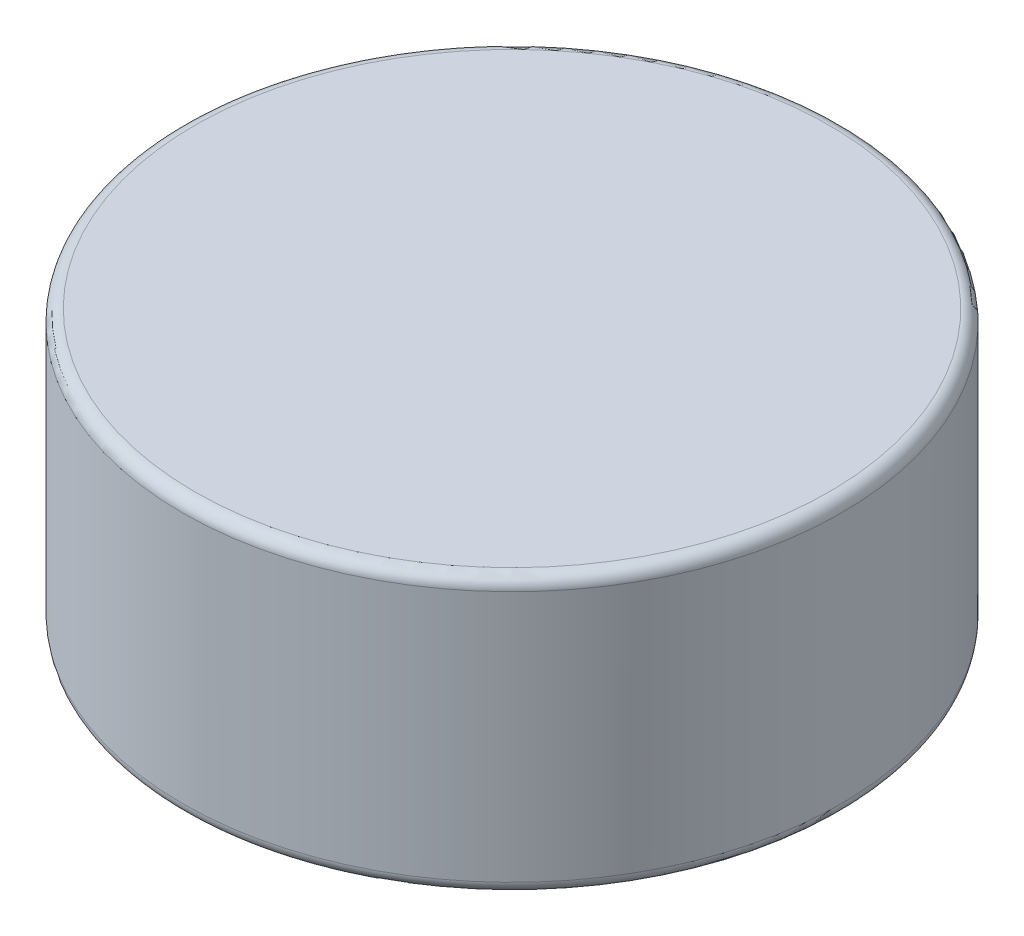
ISO-10303-21;
HEADER;
FILE_DESCRIPTION(('STEP AP214'),'2;1');
FILE_NAME('part.step','',(''),(''),'','','');
FILE_SCHEMA(('AUTOMOTIVE_DESIGN { 1 0 10303 214 1 1 1 1 }'));
ENDSEC;
DATA;
#1=APPLICATION_CONTEXT('core data for automotive mechanical design processes');
#2=APPLICATION_PROTOCOL_DEFINITION('international standard','automotive_design',2000,#1);
#3=PRODUCT_CONTEXT('',#1,'mechanical');
#4=PRODUCT('Part','Part','',(#3));
#5=PRODUCT_RELATED_PRODUCT_CATEGORY('part','',(#4));
#6=PRODUCT_DEFINITION_FORMATION('','',#4);
#7=PRODUCT_DEFINITION_CONTEXT('part definition',#1,'design');
#8=PRODUCT_DEFINITION('design','',#6,#7);
#9=PRODUCT_DEFINITION_SHAPE('','',#8);
#10=(LENGTH_UNIT() NAMED_UNIT(*) SI_UNIT(.MILLI.,.METRE.));
#11=(NAMED_UNIT(*) PLANE_ANGLE_UNIT() SI_UNIT($,.RADIAN.));
#12=(NAMED_UNIT(*) SI_UNIT($,.STERADIAN.) SOLID_ANGLE_UNIT());
#13=UNCERTAINTY_MEASURE_WITH_UNIT(LENGTH_MEASURE(1.E-05),#10,'distance_accuracy_value','');
#14=(GEOMETRIC_REPRESENTATION_CONTEXT(3) GLOBAL_UNCERTAINTY_ASSIGNED_CONTEXT((#13)) GLOBAL_UNIT_ASSIGNED_CONTEXT((#10,
#11,#12)) REPRESENTATION_CONTEXT('',''));
#15=CARTESIAN_POINT('',(0.,0.,0.));
#16=DIRECTION('',(0.,0.,1.));
#17=DIRECTION('',(1.,0.,0.));
#18=AXIS2_PLACEMENT_3D('',#15,#16,#17);
#19=CARTESIAN_POINT('',(0.,-4.31948208428438,13.5));
#20=DIRECTION('',(0.,-1.,0.));
#21=DIRECTION('',(0.,0.,-1.));
#22=AXIS2_PLACEMENT_3D('',#19,#20,#21);
#23=PLANE('',#22);
#24=CARTESIAN_POINT('',(0.,-4.31948208428438,0.));
#25=DIRECTION('',(0.,-1.,0.));
#26=DIRECTION('',(0.,0.,-1.));
#27=AXIS2_PLACEMENT_3D('',#24,#25,#26);
#28=CIRCLE('',#27,13.);
#29=CARTESIAN_POINT('',(0.,-4.31948208428438,-13.));
#30=VERTEX_POINT('',#29);
#31=EDGE_CURVE('E46',#30,#30,#28,.T.);
#32=ORIENTED_EDGE('',*,*,#31,.T.);
#33=EDGE_LOOP('',(#32));
#34=FACE_BOUND('',#33,.T.);
#35=CARTESIAN_POINT('',(0.,-4.31948208428438,0.));
#36=DIRECTION('',(0.,1.,0.));
#37=DIRECTION('',(0.,0.,1.));
#38=AXIS2_PLACEMENT_3D('',#35,#36,#37);
#39=CIRCLE('',#38,11.5);
#40=CARTESIAN_POINT('',(0.,-4.31948208428438,11.5));
#41=VERTEX_POINT('',#40);
#42=EDGE_CURVE('E62',#41,#41,#39,.T.);
#43=ORIENTED_EDGE('',*,*,#42,.T.);
#44=EDGE_LOOP('',(#43));
#45=FACE_BOUND('',#44,.T.);
#46=ADVANCED_FACE('F38',(#34,#45),#23,.T.);
#47=CARTESIAN_POINT('',(0.,30.9705853383508,0.));
#48=DIRECTION('',(0.,1.,0.));
#49=DIRECTION('',(0.,0.,1.));
#50=AXIS2_PLACEMENT_3D('',#47,#48,#49);
#51=CYLINDRICAL_SURFACE('',#50,11.5);
#52=CARTESIAN_POINT('',(0.,3.99129548143529,0.));
#53=DIRECTION('',(0.,1.,0.));
#54=DIRECTION('',(0.,0.,1.));
#55=AXIS2_PLACEMENT_3D('',#52,#53,#54);
#56=CIRCLE('',#55,11.5);
#57=CARTESIAN_POINT('',(0.,3.99129548143529,11.5));
#58=VERTEX_POINT('',#57);
#59=EDGE_CURVE('E66',#58,#58,#56,.T.);
#60=ORIENTED_EDGE('',*,*,#59,.T.);
#61=EDGE_LOOP('',(#60));
#62=FACE_BOUND('',#61,.T.);
#63=ORIENTED_EDGE('',*,*,#42,.F.);
#64=EDGE_LOOP('',(#63));
#65=FACE_BOUND('',#64,.T.);
#66=ADVANCED_FACE('F71',(#62,#65),#51,.F.);
#67=CARTESIAN_POINT('',(0.,3.99129548143529,11.5));
#68=DIRECTION('',(0.,-1.,0.));
#69=DIRECTION('',(0.,0.,-1.));
#70=AXIS2_PLACEMENT_3D('',#67,#68,#69);
#71=PLANE('',#70);
#72=ORIENTED_EDGE('',*,*,#59,.F.);
#73=EDGE_LOOP('',(#72));
#74=FACE_BOUND('',#73,.T.);
#75=ADVANCED_FACE('F74',(#74),#71,.T.);
#76=CARTESIAN_POINT('',(0.,6.99129548143529,0.));
#77=DIRECTION('',(0.,1.,0.));
#78=DIRECTION('',(0.,0.,1.));
#79=AXIS2_PLACEMENT_3D('',#76,#77,#78);
#80=PLANE('',#79);
#81=CARTESIAN_POINT('',(0.,6.99129548143529,0.));
#82=DIRECTION('',(0.,1.,0.));
#83=DIRECTION('',(0.,0.,1.));
#84=AXIS2_PLACEMENT_3D('',#81,#82,#83);
#85=CIRCLE('',#84,13.);
#86=CARTESIAN_POINT('',(0.,6.99129548143529,13.));
#87=VERTEX_POINT('',#86);
#88=EDGE_CURVE('E10',#87,#87,#85,.T.);
#89=ORIENTED_EDGE('',*,*,#88,.T.);
#90=EDGE_LOOP('',(#89));
#91=FACE_BOUND('',#90,.T.);
#92=ADVANCED_FACE('F76',(#91),#80,.T.);
#93=CARTESIAN_POINT('',(0.,30.9705853383508,0.));
#94=DIRECTION('',(0.,1.,0.));
#95=DIRECTION('',(0.,0.,1.));
#96=AXIS2_PLACEMENT_3D('',#93,#94,#95);
#97=CYLINDRICAL_SURFACE('',#96,13.5);
#98=CARTESIAN_POINT('',(0.,-3.81948208428439,0.));
#99=DIRECTION('',(0.,-1.,0.));
#100=DIRECTION('',(0.,0.,-1.));
#101=AXIS2_PLACEMENT_3D('',#98,#99,#100);
#102=CIRCLE('',#101,13.5);
#103=CARTESIAN_POINT('',(0.,-3.81948208428439,-13.5));
#104=VERTEX_POINT('',#103);
#105=EDGE_CURVE('E51',#104,#104,#102,.F.);
#106=ORIENTED_EDGE('',*,*,#105,.T.);
#107=EDGE_LOOP('',(#106));
#108=FACE_BOUND('',#107,.T.);
#109=CARTESIAN_POINT('',(0.,6.49129548143529,0.));
#110=DIRECTION('',(0.,1.,0.));
#111=DIRECTION('',(0.,0.,1.));
#112=AXIS2_PLACEMENT_3D('',#109,#110,#111);
#113=CIRCLE('',#112,13.5);
#114=CARTESIAN_POINT('',(0.,6.49129548143529,13.5));
#115=VERTEX_POINT('',#114);
#116=EDGE_CURVE('E56',#115,#115,#113,.F.);
#117=ORIENTED_EDGE('',*,*,#116,.T.);
#118=EDGE_LOOP('',(#117));
#119=FACE_BOUND('',#118,.T.);
#120=ADVANCED_FACE('F82',(#108,#119),#97,.T.);
#121=CARTESIAN_POINT('',(0.,-3.81948208428439,0.));
#122=DIRECTION('',(0.,-1.,0.));
#123=DIRECTION('',(0.,0.,-1.));
#124=AXIS2_PLACEMENT_3D('',#121,#122,#123);
#125=TOROIDAL_SURFACE('',#124,13.,0.5);
#126=ORIENTED_EDGE('',*,*,#31,.F.);
#127=EDGE_LOOP('',(#126));
#128=FACE_BOUND('',#127,.T.);
#129=ORIENTED_EDGE('',*,*,#105,.F.);
#130=EDGE_LOOP('',(#129));
#131=FACE_BOUND('',#130,.T.);
#132=ADVANCED_FACE('F90',(#128,#131),#125,.T.);
#133=CARTESIAN_POINT('',(0.,6.49129548143529,0.));
#134=DIRECTION('',(0.,1.,0.));
#135=DIRECTION('',(0.,0.,1.));
#136=AXIS2_PLACEMENT_3D('',#133,#134,#135);
#137=TOROIDAL_SURFACE('',#136,13.,0.5);
#138=ORIENTED_EDGE('',*,*,#116,.F.);
#139=EDGE_LOOP('',(#138));
#140=FACE_BOUND('',#139,.T.);
#141=ORIENTED_EDGE('',*,*,#88,.F.);
#142=EDGE_LOOP('',(#141));
#143=FACE_BOUND('',#142,.T.);
#144=ADVANCED_FACE('F40',(#140,#143),#137,.T.);
#145=CLOSED_SHELL('',(#46,#66,#75,#92,#120,#132,#144));
#146=MANIFOLD_SOLID_BREP('B2',#145);
#147=ADVANCED_BREP_SHAPE_REPRESENTATION('',(#18,#146),#14);
#148=SHAPE_DEFINITION_REPRESENTATION(#9,#147);
ENDSEC;
END-ISO-10303-21;
